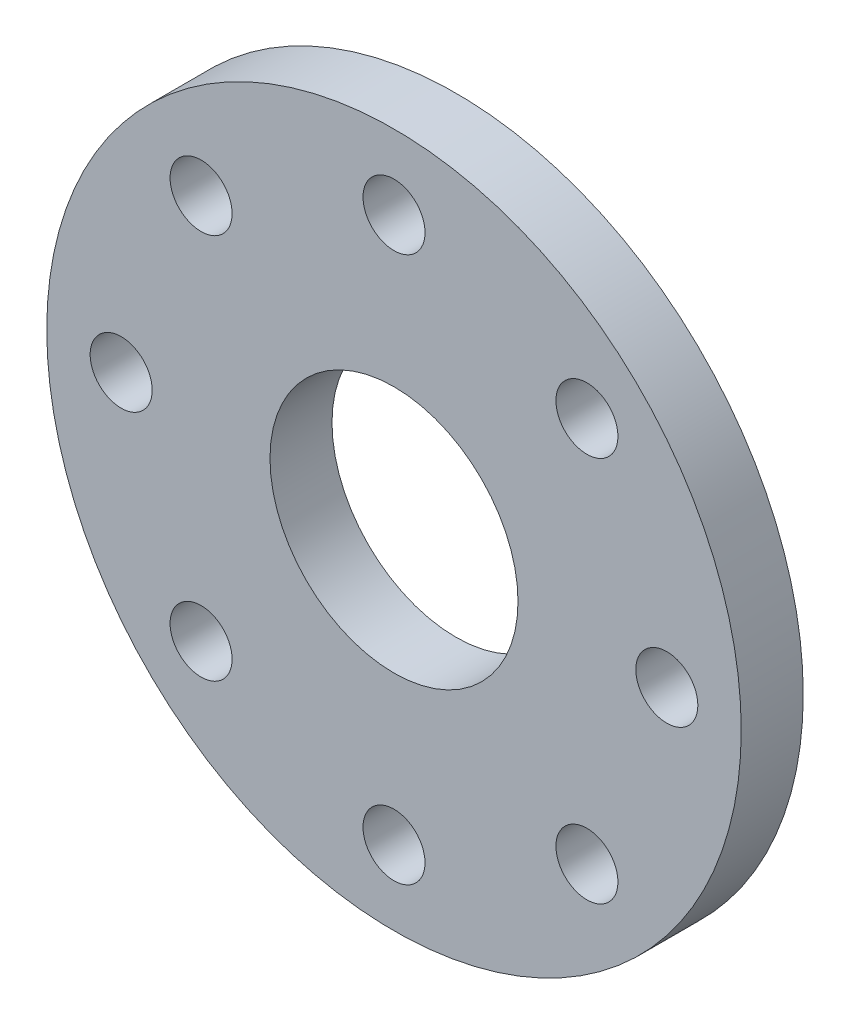
ISO-10303-21;
HEADER;
FILE_DESCRIPTION(('STEP AP214'),'2;1');
FILE_NAME('part.step','',(''),(''),'','','');
FILE_SCHEMA(('AUTOMOTIVE_DESIGN { 1 0 10303 214 1 1 1 1 }'));
ENDSEC;
DATA;
#1=APPLICATION_CONTEXT('core data for automotive mechanical design processes');
#2=APPLICATION_PROTOCOL_DEFINITION('international standard','automotive_design',2000,#1);
#3=PRODUCT_CONTEXT('',#1,'mechanical');
#4=PRODUCT('Part','Part','',(#3));
#5=PRODUCT_RELATED_PRODUCT_CATEGORY('part','',(#4));
#6=PRODUCT_DEFINITION_FORMATION('','',#4);
#7=PRODUCT_DEFINITION_CONTEXT('part definition',#1,'design');
#8=PRODUCT_DEFINITION('design','',#6,#7);
#9=PRODUCT_DEFINITION_SHAPE('','',#8);
#10=(LENGTH_UNIT() NAMED_UNIT(*) SI_UNIT(.MILLI.,.METRE.));
#11=(NAMED_UNIT(*) PLANE_ANGLE_UNIT() SI_UNIT($,.RADIAN.));
#12=(NAMED_UNIT(*) SI_UNIT($,.STERADIAN.) SOLID_ANGLE_UNIT());
#13=UNCERTAINTY_MEASURE_WITH_UNIT(LENGTH_MEASURE(1.E-05),#10,'distance_accuracy_value','');
#14=(GEOMETRIC_REPRESENTATION_CONTEXT(3) GLOBAL_UNCERTAINTY_ASSIGNED_CONTEXT((#13)) GLOBAL_UNIT_ASSIGNED_CONTEXT((#10,
#11,#12)) REPRESENTATION_CONTEXT('',''));
#15=CARTESIAN_POINT('',(0.,0.,0.));
#16=DIRECTION('',(0.,0.,1.));
#17=DIRECTION('',(1.,0.,0.));
#18=AXIS2_PLACEMENT_3D('',#15,#16,#17);
#19=CARTESIAN_POINT('',(0.,0.,2.5));
#20=DIRECTION('',(0.,0.,1.));
#21=DIRECTION('',(1.,0.,0.));
#22=AXIS2_PLACEMENT_3D('',#19,#20,#21);
#23=PLANE('',#22);
#24=CARTESIAN_POINT('',(-10.9999999999995,-4.68958205601666E-13,2.5));
#25=DIRECTION('',(0.,0.,1.));
#26=DIRECTION('',(1.,0.,0.));
#27=AXIS2_PLACEMENT_3D('',#24,#25,#26);
#28=CIRCLE('',#27,1.25000000000069);
#29=CARTESIAN_POINT('',(-9.74999999999884,-4.68958205601666E-13,2.5));
#30=VERTEX_POINT('',#29);
#31=EDGE_CURVE('E84',#30,#30,#28,.T.);
#32=ORIENTED_EDGE('',*,*,#31,.F.);
#33=EDGE_LOOP('',(#32));
#34=FACE_BOUND('',#33,.T.);
#35=CARTESIAN_POINT('',(9.35222188245208E-13,-11.,2.5));
#36=DIRECTION('',(0.,0.,1.));
#37=DIRECTION('',(1.,0.,0.));
#38=AXIS2_PLACEMENT_3D('',#35,#36,#37);
#39=CIRCLE('',#38,1.25000000000097);
#40=CARTESIAN_POINT('',(1.2500000000019,-11.,2.5));
#41=VERTEX_POINT('',#40);
#42=EDGE_CURVE('E72',#41,#41,#39,.T.);
#43=ORIENTED_EDGE('',*,*,#42,.F.);
#44=EDGE_LOOP('',(#43));
#45=FACE_BOUND('',#44,.T.);
#46=CARTESIAN_POINT('',(11.0000000000005,4.67611094122604E-13,2.5));
#47=DIRECTION('',(0.,0.,1.));
#48=DIRECTION('',(1.,0.,0.));
#49=AXIS2_PLACEMENT_3D('',#46,#47,#48);
#50=CIRCLE('',#49,1.25000000000035);
#51=CARTESIAN_POINT('',(12.2500000000008,4.67611094122604E-13,2.5));
#52=VERTEX_POINT('',#51);
#53=EDGE_CURVE('E60',#52,#52,#50,.T.);
#54=ORIENTED_EDGE('',*,*,#53,.F.);
#55=EDGE_LOOP('',(#54));
#56=FACE_BOUND('',#55,.T.);
#57=CARTESIAN_POINT('',(0.,11.,2.5));
#58=DIRECTION('',(0.,0.,1.));
#59=DIRECTION('',(1.,0.,0.));
#60=AXIS2_PLACEMENT_3D('',#57,#58,#59);
#61=CIRCLE('',#60,1.25);
#62=CARTESIAN_POINT('',(1.25,11.,2.5));
#63=VERTEX_POINT('',#62);
#64=EDGE_CURVE('E48',#63,#63,#61,.T.);
#65=ORIENTED_EDGE('',*,*,#64,.F.);
#66=EDGE_LOOP('',(#65));
#67=FACE_BOUND('',#66,.T.);
#68=CARTESIAN_POINT('',(0.,0.,2.5));
#69=DIRECTION('',(0.,0.,1.));
#70=DIRECTION('',(1.,0.,0.));
#71=AXIS2_PLACEMENT_3D('',#68,#69,#70);
#72=CIRCLE('',#71,14.);
#73=CARTESIAN_POINT('',(14.,0.,2.5));
#74=VERTEX_POINT('',#73);
#75=EDGE_CURVE('E10',#74,#74,#72,.T.);
#76=ORIENTED_EDGE('',*,*,#75,.T.);
#77=EDGE_LOOP('',(#76));
#78=FACE_BOUND('',#77,.T.);
#79=CARTESIAN_POINT('',(0.,0.,2.5));
#80=DIRECTION('',(0.,0.,1.));
#81=DIRECTION('',(1.,0.,0.));
#82=AXIS2_PLACEMENT_3D('',#79,#80,#81);
#83=CIRCLE('',#82,5.);
#84=CARTESIAN_POINT('',(5.,0.,2.5));
#85=VERTEX_POINT('',#84);
#86=EDGE_CURVE('E43',#85,#85,#83,.T.);
#87=ORIENTED_EDGE('',*,*,#86,.F.);
#88=EDGE_LOOP('',(#87));
#89=FACE_BOUND('',#88,.T.);
#90=CARTESIAN_POINT('',(7.77817459305216,7.77817459305235,2.5));
#91=DIRECTION('',(0.,0.,1.));
#92=DIRECTION('',(1.,0.,0.));
#93=AXIS2_PLACEMENT_3D('',#90,#91,#92);
#94=CIRCLE('',#93,1.25000000000005);
#95=CARTESIAN_POINT('',(9.02817459305221,7.77817459305235,2.5));
#96=VERTEX_POINT('',#95);
#97=EDGE_CURVE('E54',#96,#96,#94,.T.);
#98=ORIENTED_EDGE('',*,*,#97,.F.);
#99=EDGE_LOOP('',(#98));
#100=FACE_BOUND('',#99,.T.);
#101=CARTESIAN_POINT('',(7.77817459305282,-7.77817459305169,2.5));
#102=DIRECTION('',(0.,0.,1.));
#103=DIRECTION('',(1.,0.,0.));
#104=AXIS2_PLACEMENT_3D('',#101,#102,#103);
#105=CIRCLE('',#104,1.25000000000072);
#106=CARTESIAN_POINT('',(9.02817459305354,-7.77817459305169,2.5));
#107=VERTEX_POINT('',#106);
#108=EDGE_CURVE('E66',#107,#107,#105,.T.);
#109=ORIENTED_EDGE('',*,*,#108,.F.);
#110=EDGE_LOOP('',(#109));
#111=FACE_BOUND('',#110,.T.);
#112=CARTESIAN_POINT('',(-7.77817459305122,-7.77817459305235,2.5));
#113=DIRECTION('',(0.,0.,1.));
#114=DIRECTION('',(1.,0.,0.));
#115=AXIS2_PLACEMENT_3D('',#112,#113,#114);
#116=CIRCLE('',#115,1.25000000000095);
#117=CARTESIAN_POINT('',(-6.52817459305027,-7.77817459305235,2.5));
#118=VERTEX_POINT('',#117);
#119=EDGE_CURVE('E78',#118,#118,#116,.T.);
#120=ORIENTED_EDGE('',*,*,#119,.F.);
#121=EDGE_LOOP('',(#120));
#122=FACE_BOUND('',#121,.T.);
#123=CARTESIAN_POINT('',(-7.77817459305189,7.77817459305169,2.5));
#124=DIRECTION('',(0.,0.,1.));
#125=DIRECTION('',(1.,0.,0.));
#126=AXIS2_PLACEMENT_3D('',#123,#124,#125);
#127=CIRCLE('',#126,1.25000000000036);
#128=CARTESIAN_POINT('',(-6.52817459305153,7.77817459305169,2.5));
#129=VERTEX_POINT('',#128);
#130=EDGE_CURVE('E90',#129,#129,#127,.T.);
#131=ORIENTED_EDGE('',*,*,#130,.F.);
#132=EDGE_LOOP('',(#131));
#133=FACE_BOUND('',#132,.T.);
#134=ADVANCED_FACE('F32',(#34,#45,#56,#67,#78,#89,#100,#111,#122,#133),#23,.T.);
#135=CARTESIAN_POINT('',(0.,0.,0.));
#136=DIRECTION('',(0.,0.,1.));
#137=DIRECTION('',(1.,0.,0.));
#138=AXIS2_PLACEMENT_3D('',#135,#136,#137);
#139=PLANE('',#138);
#140=CARTESIAN_POINT('',(0.,0.,0.));
#141=DIRECTION('',(0.,0.,1.));
#142=DIRECTION('',(1.,0.,0.));
#143=AXIS2_PLACEMENT_3D('',#140,#141,#142);
#144=CIRCLE('',#143,14.);
#145=CARTESIAN_POINT('',(14.,0.,0.));
#146=VERTEX_POINT('',#145);
#147=EDGE_CURVE('E36',#146,#146,#144,.T.);
#148=ORIENTED_EDGE('',*,*,#147,.F.);
#149=EDGE_LOOP('',(#148));
#150=FACE_BOUND('',#149,.T.);
#151=CARTESIAN_POINT('',(0.,0.,0.));
#152=DIRECTION('',(0.,0.,1.));
#153=DIRECTION('',(1.,0.,0.));
#154=AXIS2_PLACEMENT_3D('',#151,#152,#153);
#155=CIRCLE('',#154,5.);
#156=CARTESIAN_POINT('',(5.,0.,0.));
#157=VERTEX_POINT('',#156);
#158=EDGE_CURVE('E45',#157,#157,#155,.T.);
#159=ORIENTED_EDGE('',*,*,#158,.T.);
#160=EDGE_LOOP('',(#159));
#161=FACE_BOUND('',#160,.T.);
#162=CARTESIAN_POINT('',(0.,11.,0.));
#163=DIRECTION('',(0.,0.,1.));
#164=DIRECTION('',(1.,0.,0.));
#165=AXIS2_PLACEMENT_3D('',#162,#163,#164);
#166=CIRCLE('',#165,1.25);
#167=CARTESIAN_POINT('',(1.25,11.,0.));
#168=VERTEX_POINT('',#167);
#169=EDGE_CURVE('E51',#168,#168,#166,.T.);
#170=ORIENTED_EDGE('',*,*,#169,.T.);
#171=EDGE_LOOP('',(#170));
#172=FACE_BOUND('',#171,.T.);
#173=CARTESIAN_POINT('',(7.77817459305216,7.77817459305235,0.));
#174=DIRECTION('',(0.,0.,1.));
#175=DIRECTION('',(1.,0.,0.));
#176=AXIS2_PLACEMENT_3D('',#173,#174,#175);
#177=CIRCLE('',#176,1.25000000000005);
#178=CARTESIAN_POINT('',(9.02817459305221,7.77817459305235,0.));
#179=VERTEX_POINT('',#178);
#180=EDGE_CURVE('E57',#179,#179,#177,.T.);
#181=ORIENTED_EDGE('',*,*,#180,.T.);
#182=EDGE_LOOP('',(#181));
#183=FACE_BOUND('',#182,.T.);
#184=CARTESIAN_POINT('',(11.0000000000005,4.67611094122604E-13,0.));
#185=DIRECTION('',(0.,0.,1.));
#186=DIRECTION('',(1.,0.,0.));
#187=AXIS2_PLACEMENT_3D('',#184,#185,#186);
#188=CIRCLE('',#187,1.25000000000035);
#189=CARTESIAN_POINT('',(12.2500000000008,4.67611094122604E-13,0.));
#190=VERTEX_POINT('',#189);
#191=EDGE_CURVE('E63',#190,#190,#188,.T.);
#192=ORIENTED_EDGE('',*,*,#191,.T.);
#193=EDGE_LOOP('',(#192));
#194=FACE_BOUND('',#193,.T.);
#195=CARTESIAN_POINT('',(7.77817459305282,-7.77817459305169,0.));
#196=DIRECTION('',(0.,0.,1.));
#197=DIRECTION('',(1.,0.,0.));
#198=AXIS2_PLACEMENT_3D('',#195,#196,#197);
#199=CIRCLE('',#198,1.25000000000072);
#200=CARTESIAN_POINT('',(9.02817459305354,-7.77817459305169,0.));
#201=VERTEX_POINT('',#200);
#202=EDGE_CURVE('E69',#201,#201,#199,.T.);
#203=ORIENTED_EDGE('',*,*,#202,.T.);
#204=EDGE_LOOP('',(#203));
#205=FACE_BOUND('',#204,.T.);
#206=CARTESIAN_POINT('',(9.35222188245208E-13,-11.,0.));
#207=DIRECTION('',(0.,0.,1.));
#208=DIRECTION('',(1.,0.,0.));
#209=AXIS2_PLACEMENT_3D('',#206,#207,#208);
#210=CIRCLE('',#209,1.25000000000097);
#211=CARTESIAN_POINT('',(1.2500000000019,-11.,0.));
#212=VERTEX_POINT('',#211);
#213=EDGE_CURVE('E75',#212,#212,#210,.T.);
#214=ORIENTED_EDGE('',*,*,#213,.T.);
#215=EDGE_LOOP('',(#214));
#216=FACE_BOUND('',#215,.T.);
#217=CARTESIAN_POINT('',(-7.77817459305122,-7.77817459305235,0.));
#218=DIRECTION('',(0.,0.,1.));
#219=DIRECTION('',(1.,0.,0.));
#220=AXIS2_PLACEMENT_3D('',#217,#218,#219);
#221=CIRCLE('',#220,1.25000000000095);
#222=CARTESIAN_POINT('',(-6.52817459305027,-7.77817459305235,0.));
#223=VERTEX_POINT('',#222);
#224=EDGE_CURVE('E81',#223,#223,#221,.T.);
#225=ORIENTED_EDGE('',*,*,#224,.T.);
#226=EDGE_LOOP('',(#225));
#227=FACE_BOUND('',#226,.T.);
#228=CARTESIAN_POINT('',(-10.9999999999995,-4.68958205601666E-13,0.));
#229=DIRECTION('',(0.,0.,1.));
#230=DIRECTION('',(1.,0.,0.));
#231=AXIS2_PLACEMENT_3D('',#228,#229,#230);
#232=CIRCLE('',#231,1.25000000000069);
#233=CARTESIAN_POINT('',(-9.74999999999884,-4.68958205601666E-13,0.));
#234=VERTEX_POINT('',#233);
#235=EDGE_CURVE('E87',#234,#234,#232,.T.);
#236=ORIENTED_EDGE('',*,*,#235,.T.);
#237=EDGE_LOOP('',(#236));
#238=FACE_BOUND('',#237,.T.);
#239=CARTESIAN_POINT('',(-7.77817459305189,7.77817459305169,0.));
#240=DIRECTION('',(0.,0.,1.));
#241=DIRECTION('',(1.,0.,0.));
#242=AXIS2_PLACEMENT_3D('',#239,#240,#241);
#243=CIRCLE('',#242,1.25000000000036);
#244=CARTESIAN_POINT('',(-6.52817459305153,7.77817459305169,0.));
#245=VERTEX_POINT('',#244);
#246=EDGE_CURVE('E93',#245,#245,#243,.T.);
#247=ORIENTED_EDGE('',*,*,#246,.T.);
#248=EDGE_LOOP('',(#247));
#249=FACE_BOUND('',#248,.T.);
#250=ADVANCED_FACE('F103',(#150,#161,#172,#183,#194,#205,#216,#227,#238,#249),#139,.F.);
#251=CARTESIAN_POINT('',(0.,0.,2.5));
#252=DIRECTION('',(0.,0.,-1.));
#253=DIRECTION('',(-1.,0.,0.));
#254=AXIS2_PLACEMENT_3D('',#251,#252,#253);
#255=CYLINDRICAL_SURFACE('',#254,14.);
#256=ORIENTED_EDGE('',*,*,#75,.F.);
#257=EDGE_LOOP('',(#256));
#258=FACE_BOUND('',#257,.T.);
#259=ORIENTED_EDGE('',*,*,#147,.T.);
#260=EDGE_LOOP('',(#259));
#261=FACE_BOUND('',#260,.T.);
#262=ADVANCED_FACE('F34',(#258,#261),#255,.T.);
#263=CARTESIAN_POINT('',(0.,0.,2.5));
#264=DIRECTION('',(0.,0.,-1.));
#265=DIRECTION('',(-1.,0.,0.));
#266=AXIS2_PLACEMENT_3D('',#263,#264,#265);
#267=CYLINDRICAL_SURFACE('',#266,5.);
#268=ORIENTED_EDGE('',*,*,#86,.T.);
#269=EDGE_LOOP('',(#268));
#270=FACE_BOUND('',#269,.T.);
#271=ORIENTED_EDGE('',*,*,#158,.F.);
#272=EDGE_LOOP('',(#271));
#273=FACE_BOUND('',#272,.T.);
#274=ADVANCED_FACE('F113',(#270,#273),#267,.F.);
#275=CARTESIAN_POINT('',(0.,11.,2.5));
#276=DIRECTION('',(0.,0.,-1.));
#277=DIRECTION('',(-1.,0.,0.));
#278=AXIS2_PLACEMENT_3D('',#275,#276,#277);
#279=CYLINDRICAL_SURFACE('',#278,1.25);
#280=ORIENTED_EDGE('',*,*,#64,.T.);
#281=EDGE_LOOP('',(#280));
#282=FACE_BOUND('',#281,.T.);
#283=ORIENTED_EDGE('',*,*,#169,.F.);
#284=EDGE_LOOP('',(#283));
#285=FACE_BOUND('',#284,.T.);
#286=ADVANCED_FACE('F116',(#282,#285),#279,.F.);
#287=CARTESIAN_POINT('',(7.77817459305216,7.77817459305235,2.5));
#288=DIRECTION('',(0.,0.,-1.));
#289=DIRECTION('',(-1.,0.,0.));
#290=AXIS2_PLACEMENT_3D('',#287,#288,#289);
#291=CYLINDRICAL_SURFACE('',#290,1.25000000000005);
#292=ORIENTED_EDGE('',*,*,#97,.T.);
#293=EDGE_LOOP('',(#292));
#294=FACE_BOUND('',#293,.T.);
#295=ORIENTED_EDGE('',*,*,#180,.F.);
#296=EDGE_LOOP('',(#295));
#297=FACE_BOUND('',#296,.T.);
#298=ADVANCED_FACE('F120',(#294,#297),#291,.F.);
#299=CARTESIAN_POINT('',(11.0000000000005,4.67611094122604E-13,2.5));
#300=DIRECTION('',(0.,0.,-1.));
#301=DIRECTION('',(-1.,0.,0.));
#302=AXIS2_PLACEMENT_3D('',#299,#300,#301);
#303=CYLINDRICAL_SURFACE('',#302,1.25000000000035);
#304=ORIENTED_EDGE('',*,*,#53,.T.);
#305=EDGE_LOOP('',(#304));
#306=FACE_BOUND('',#305,.T.);
#307=ORIENTED_EDGE('',*,*,#191,.F.);
#308=EDGE_LOOP('',(#307));
#309=FACE_BOUND('',#308,.T.);
#310=ADVANCED_FACE('F124',(#306,#309),#303,.F.);
#311=CARTESIAN_POINT('',(7.77817459305282,-7.77817459305169,2.5));
#312=DIRECTION('',(0.,0.,-1.));
#313=DIRECTION('',(-1.,0.,0.));
#314=AXIS2_PLACEMENT_3D('',#311,#312,#313);
#315=CYLINDRICAL_SURFACE('',#314,1.25000000000072);
#316=ORIENTED_EDGE('',*,*,#108,.T.);
#317=EDGE_LOOP('',(#316));
#318=FACE_BOUND('',#317,.T.);
#319=ORIENTED_EDGE('',*,*,#202,.F.);
#320=EDGE_LOOP('',(#319));
#321=FACE_BOUND('',#320,.T.);
#322=ADVANCED_FACE('F128',(#318,#321),#315,.F.);
#323=CARTESIAN_POINT('',(9.35222188245208E-13,-11.,2.5));
#324=DIRECTION('',(0.,0.,-1.));
#325=DIRECTION('',(-1.,0.,0.));
#326=AXIS2_PLACEMENT_3D('',#323,#324,#325);
#327=CYLINDRICAL_SURFACE('',#326,1.25000000000097);
#328=ORIENTED_EDGE('',*,*,#42,.T.);
#329=EDGE_LOOP('',(#328));
#330=FACE_BOUND('',#329,.T.);
#331=ORIENTED_EDGE('',*,*,#213,.F.);
#332=EDGE_LOOP('',(#331));
#333=FACE_BOUND('',#332,.T.);
#334=ADVANCED_FACE('F132',(#330,#333),#327,.F.);
#335=CARTESIAN_POINT('',(-7.77817459305122,-7.77817459305235,2.5));
#336=DIRECTION('',(0.,0.,-1.));
#337=DIRECTION('',(-1.,0.,0.));
#338=AXIS2_PLACEMENT_3D('',#335,#336,#337);
#339=CYLINDRICAL_SURFACE('',#338,1.25000000000095);
#340=ORIENTED_EDGE('',*,*,#119,.T.);
#341=EDGE_LOOP('',(#340));
#342=FACE_BOUND('',#341,.T.);
#343=ORIENTED_EDGE('',*,*,#224,.F.);
#344=EDGE_LOOP('',(#343));
#345=FACE_BOUND('',#344,.T.);
#346=ADVANCED_FACE('F136',(#342,#345),#339,.F.);
#347=CARTESIAN_POINT('',(-10.9999999999995,-4.68958205601666E-13,2.5));
#348=DIRECTION('',(0.,0.,-1.));
#349=DIRECTION('',(-1.,0.,0.));
#350=AXIS2_PLACEMENT_3D('',#347,#348,#349);
#351=CYLINDRICAL_SURFACE('',#350,1.25000000000069);
#352=ORIENTED_EDGE('',*,*,#31,.T.);
#353=EDGE_LOOP('',(#352));
#354=FACE_BOUND('',#353,.T.);
#355=ORIENTED_EDGE('',*,*,#235,.F.);
#356=EDGE_LOOP('',(#355));
#357=FACE_BOUND('',#356,.T.);
#358=ADVANCED_FACE('F140',(#354,#357),#351,.F.);
#359=CARTESIAN_POINT('',(-7.77817459305189,7.77817459305169,2.5));
#360=DIRECTION('',(0.,0.,-1.));
#361=DIRECTION('',(-1.,0.,0.));
#362=AXIS2_PLACEMENT_3D('',#359,#360,#361);
#363=CYLINDRICAL_SURFACE('',#362,1.25000000000036);
#364=ORIENTED_EDGE('',*,*,#130,.T.);
#365=EDGE_LOOP('',(#364));
#366=FACE_BOUND('',#365,.T.);
#367=ORIENTED_EDGE('',*,*,#246,.F.);
#368=EDGE_LOOP('',(#367));
#369=FACE_BOUND('',#368,.T.);
#370=ADVANCED_FACE('F99',(#366,#369),#363,.F.);
#371=CLOSED_SHELL('',(#134,#250,#262,#274,#286,#298,#310,#322,#334,#346,#358,#370));
#372=MANIFOLD_SOLID_BREP('B2',#371);
#373=ADVANCED_BREP_SHAPE_REPRESENTATION('',(#18,#372),#14);
#374=SHAPE_DEFINITION_REPRESENTATION(#9,#373);
ENDSEC;
END-ISO-10303-21;
